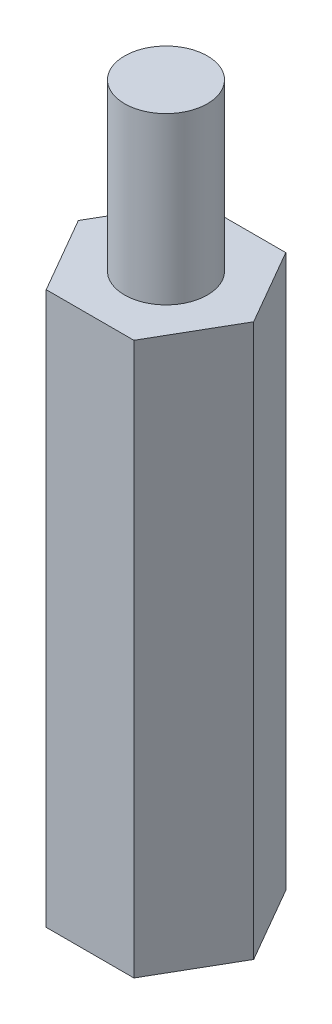
ISO-10303-21;
HEADER;
FILE_DESCRIPTION(('STEP AP214'),'2;1');
FILE_NAME('part.step','',(''),(''),'','','');
FILE_SCHEMA(('AUTOMOTIVE_DESIGN { 1 0 10303 214 1 1 1 1 }'));
ENDSEC;
DATA;
#1=APPLICATION_CONTEXT('core data for automotive mechanical design processes');
#2=APPLICATION_PROTOCOL_DEFINITION('international standard','automotive_design',2000,#1);
#3=PRODUCT_CONTEXT('',#1,'mechanical');
#4=PRODUCT('Part','Part','',(#3));
#5=PRODUCT_RELATED_PRODUCT_CATEGORY('part','',(#4));
#6=PRODUCT_DEFINITION_FORMATION('','',#4);
#7=PRODUCT_DEFINITION_CONTEXT('part definition',#1,'design');
#8=PRODUCT_DEFINITION('design','',#6,#7);
#9=PRODUCT_DEFINITION_SHAPE('','',#8);
#10=(LENGTH_UNIT() NAMED_UNIT(*) SI_UNIT(.MILLI.,.METRE.));
#11=(NAMED_UNIT(*) PLANE_ANGLE_UNIT() SI_UNIT($,.RADIAN.));
#12=(NAMED_UNIT(*) SI_UNIT($,.STERADIAN.) SOLID_ANGLE_UNIT());
#13=UNCERTAINTY_MEASURE_WITH_UNIT(LENGTH_MEASURE(1.E-05),#10,'distance_accuracy_value','');
#14=(GEOMETRIC_REPRESENTATION_CONTEXT(3) GLOBAL_UNCERTAINTY_ASSIGNED_CONTEXT((#13)) GLOBAL_UNIT_ASSIGNED_CONTEXT((#10,
#11,#12)) REPRESENTATION_CONTEXT('',''));
#15=CARTESIAN_POINT('',(0.,0.,0.));
#16=DIRECTION('',(0.,0.,1.));
#17=DIRECTION('',(1.,0.,0.));
#18=AXIS2_PLACEMENT_3D('',#15,#16,#17);
#19=CARTESIAN_POINT('',(0.,20.,0.));
#20=DIRECTION('',(0.,1.,0.));
#21=DIRECTION('',(0.,0.,1.));
#22=AXIS2_PLACEMENT_3D('',#19,#20,#21);
#23=PLANE('',#22);
#24=DIRECTION('',(1.,0.,0.));
#25=VECTOR('',#24,1.);
#26=CARTESIAN_POINT('',(-1.58771324027147,20.,2.75));
#27=LINE('',#26,#25);
#28=CARTESIAN_POINT('',(-1.58771324027147,20.,2.75));
#29=VERTEX_POINT('',#28);
#30=CARTESIAN_POINT('',(1.58771324027147,20.,2.75));
#31=VERTEX_POINT('',#30);
#32=EDGE_CURVE('E136',#29,#31,#27,.T.);
#33=ORIENTED_EDGE('',*,*,#32,.T.);
#34=DIRECTION('',(0.5,0.,-0.866025403784439));
#35=VECTOR('',#34,1.);
#36=CARTESIAN_POINT('',(1.58771324027147,20.,2.75));
#37=LINE('',#36,#35);
#38=CARTESIAN_POINT('',(3.17542648054294,20.,0.));
#39=VERTEX_POINT('',#38);
#40=EDGE_CURVE('E93',#31,#39,#37,.T.);
#41=ORIENTED_EDGE('',*,*,#40,.T.);
#42=DIRECTION('',(-0.5,0.,-0.866025403784439));
#43=VECTOR('',#42,1.);
#44=CARTESIAN_POINT('',(3.17542648054294,20.,0.));
#45=LINE('',#44,#43);
#46=CARTESIAN_POINT('',(1.58771324027147,20.,-2.75));
#47=VERTEX_POINT('',#46);
#48=EDGE_CURVE('E107',#39,#47,#45,.T.);
#49=ORIENTED_EDGE('',*,*,#48,.T.);
#50=DIRECTION('',(-1.,0.,0.));
#51=VECTOR('',#50,1.);
#52=CARTESIAN_POINT('',(1.58771324027147,20.,-2.75));
#53=LINE('',#52,#51);
#54=CARTESIAN_POINT('',(-1.58771324027147,20.,-2.75));
#55=VERTEX_POINT('',#54);
#56=EDGE_CURVE('E101',#47,#55,#53,.T.);
#57=ORIENTED_EDGE('',*,*,#56,.T.);
#58=DIRECTION('',(-0.5,0.,0.866025403784439));
#59=VECTOR('',#58,1.);
#60=CARTESIAN_POINT('',(-1.58771324027147,20.,-2.75));
#61=LINE('',#60,#59);
#62=CARTESIAN_POINT('',(-3.17542648054294,20.,0.));
#63=VERTEX_POINT('',#62);
#64=EDGE_CURVE('E105',#55,#63,#61,.T.);
#65=ORIENTED_EDGE('',*,*,#64,.T.);
#66=DIRECTION('',(0.5,0.,0.866025403784439));
#67=VECTOR('',#66,1.);
#68=CARTESIAN_POINT('',(-3.17542648054294,20.,0.));
#69=LINE('',#68,#67);
#70=EDGE_CURVE('E55',#63,#29,#69,.T.);
#71=ORIENTED_EDGE('',*,*,#70,.T.);
#72=EDGE_LOOP('',(#33,#41,#49,#57,#65,#71));
#73=FACE_BOUND('',#72,.T.);
#74=CARTESIAN_POINT('',(0.,20.,0.));
#75=DIRECTION('',(0.,1.,0.));
#76=DIRECTION('',(0.,0.,1.));
#77=AXIS2_PLACEMENT_3D('',#74,#75,#76);
#78=CIRCLE('',#77,1.5);
#79=CARTESIAN_POINT('',(0.,20.,1.5));
#80=VERTEX_POINT('',#79);
#81=EDGE_CURVE('E191',#80,#80,#78,.T.);
#82=ORIENTED_EDGE('',*,*,#81,.F.);
#83=EDGE_LOOP('',(#82));
#84=FACE_BOUND('',#83,.T.);
#85=ADVANCED_FACE('F38',(#73,#84),#23,.T.);
#86=CARTESIAN_POINT('',(-1.58771324027147,20.,2.75));
#87=DIRECTION('',(0.,0.,-1.));
#88=DIRECTION('',(-1.,0.,0.));
#89=AXIS2_PLACEMENT_3D('',#86,#87,#88);
#90=PLANE('',#89);
#91=DIRECTION('',(1.,0.,0.));
#92=VECTOR('',#91,1.);
#93=CARTESIAN_POINT('',(-1.58771324027147,0.,2.75));
#94=LINE('',#93,#92);
#95=CARTESIAN_POINT('',(-1.58771324027147,0.,2.75));
#96=VERTEX_POINT('',#95);
#97=CARTESIAN_POINT('',(1.58771324027147,0.,2.75));
#98=VERTEX_POINT('',#97);
#99=EDGE_CURVE('E125',#96,#98,#94,.T.);
#100=ORIENTED_EDGE('',*,*,#99,.T.);
#101=DIRECTION('',(0.,-1.,0.));
#102=VECTOR('',#101,1.);
#103=CARTESIAN_POINT('',(1.58771324027147,20.,2.75));
#104=LINE('',#103,#102);
#105=EDGE_CURVE('E11',#31,#98,#104,.T.);
#106=ORIENTED_EDGE('',*,*,#105,.F.);
#107=ORIENTED_EDGE('',*,*,#32,.F.);
#108=DIRECTION('',(0.,-1.,0.));
#109=VECTOR('',#108,1.);
#110=CARTESIAN_POINT('',(-1.58771324027147,20.,2.75));
#111=LINE('',#110,#109);
#112=EDGE_CURVE('E121',#29,#96,#111,.T.);
#113=ORIENTED_EDGE('',*,*,#112,.T.);
#114=EDGE_LOOP('',(#100,#106,#107,#113));
#115=FACE_BOUND('',#114,.T.);
#116=ADVANCED_FACE('F40',(#115),#90,.F.);
#117=CARTESIAN_POINT('',(1.58771324027147,20.,2.75));
#118=DIRECTION('',(-0.866025403784439,0.,-0.5));
#119=DIRECTION('',(-0.5,0.,0.866025403784439));
#120=AXIS2_PLACEMENT_3D('',#117,#118,#119);
#121=PLANE('',#120);
#122=DIRECTION('',(0.5,0.,-0.866025403784439));
#123=VECTOR('',#122,1.);
#124=CARTESIAN_POINT('',(1.58771324027147,0.,2.75));
#125=LINE('',#124,#123);
#126=CARTESIAN_POINT('',(3.17542648054294,0.,0.));
#127=VERTEX_POINT('',#126);
#128=EDGE_CURVE('E128',#98,#127,#125,.T.);
#129=ORIENTED_EDGE('',*,*,#128,.T.);
#130=DIRECTION('',(0.,-1.,0.));
#131=VECTOR('',#130,1.);
#132=CARTESIAN_POINT('',(3.17542648054294,20.,0.));
#133=LINE('',#132,#131);
#134=EDGE_CURVE('E47',#39,#127,#133,.T.);
#135=ORIENTED_EDGE('',*,*,#134,.F.);
#136=ORIENTED_EDGE('',*,*,#40,.F.);
#137=ORIENTED_EDGE('',*,*,#105,.T.);
#138=EDGE_LOOP('',(#129,#135,#136,#137));
#139=FACE_BOUND('',#138,.T.);
#140=ADVANCED_FACE('F165',(#139),#121,.F.);
#141=CARTESIAN_POINT('',(3.17542648054294,20.,0.));
#142=DIRECTION('',(-0.866025403784439,0.,0.5));
#143=DIRECTION('',(0.5,0.,0.866025403784439));
#144=AXIS2_PLACEMENT_3D('',#141,#142,#143);
#145=PLANE('',#144);
#146=DIRECTION('',(-0.5,0.,-0.866025403784439));
#147=VECTOR('',#146,1.);
#148=CARTESIAN_POINT('',(3.17542648054294,0.,0.));
#149=LINE('',#148,#147);
#150=CARTESIAN_POINT('',(1.58771324027147,0.,-2.75));
#151=VERTEX_POINT('',#150);
#152=EDGE_CURVE('E131',#127,#151,#149,.T.);
#153=ORIENTED_EDGE('',*,*,#152,.T.);
#154=DIRECTION('',(0.,-1.,0.));
#155=VECTOR('',#154,1.);
#156=CARTESIAN_POINT('',(1.58771324027147,20.,-2.75));
#157=LINE('',#156,#155);
#158=EDGE_CURVE('E116',#47,#151,#157,.T.);
#159=ORIENTED_EDGE('',*,*,#158,.F.);
#160=ORIENTED_EDGE('',*,*,#48,.F.);
#161=ORIENTED_EDGE('',*,*,#134,.T.);
#162=EDGE_LOOP('',(#153,#159,#160,#161));
#163=FACE_BOUND('',#162,.T.);
#164=ADVANCED_FACE('F142',(#163),#145,.F.);
#165=CARTESIAN_POINT('',(1.58771324027147,20.,-2.75));
#166=DIRECTION('',(0.,0.,1.));
#167=DIRECTION('',(1.,0.,0.));
#168=AXIS2_PLACEMENT_3D('',#165,#166,#167);
#169=PLANE('',#168);
#170=DIRECTION('',(-1.,0.,0.));
#171=VECTOR('',#170,1.);
#172=CARTESIAN_POINT('',(1.58771324027147,0.,-2.75));
#173=LINE('',#172,#171);
#174=CARTESIAN_POINT('',(-1.58771324027147,0.,-2.75));
#175=VERTEX_POINT('',#174);
#176=EDGE_CURVE('E115',#151,#175,#173,.T.);
#177=ORIENTED_EDGE('',*,*,#176,.T.);
#178=DIRECTION('',(0.,-1.,0.));
#179=VECTOR('',#178,1.);
#180=CARTESIAN_POINT('',(-1.58771324027147,20.,-2.75));
#181=LINE('',#180,#179);
#182=EDGE_CURVE('E112',#55,#175,#181,.T.);
#183=ORIENTED_EDGE('',*,*,#182,.F.);
#184=ORIENTED_EDGE('',*,*,#56,.F.);
#185=ORIENTED_EDGE('',*,*,#158,.T.);
#186=EDGE_LOOP('',(#177,#183,#184,#185));
#187=FACE_BOUND('',#186,.T.);
#188=ADVANCED_FACE('F113',(#187),#169,.F.);
#189=CARTESIAN_POINT('',(-1.58771324027147,20.,-2.75));
#190=DIRECTION('',(0.866025403784439,0.,0.5));
#191=DIRECTION('',(0.5,0.,-0.866025403784439));
#192=AXIS2_PLACEMENT_3D('',#189,#190,#191);
#193=PLANE('',#192);
#194=DIRECTION('',(-0.5,0.,0.866025403784439));
#195=VECTOR('',#194,1.);
#196=CARTESIAN_POINT('',(-1.58771324027147,0.,-2.75));
#197=LINE('',#196,#195);
#198=CARTESIAN_POINT('',(-3.17542648054294,0.,0.));
#199=VERTEX_POINT('',#198);
#200=EDGE_CURVE('E79',#175,#199,#197,.T.);
#201=ORIENTED_EDGE('',*,*,#200,.T.);
#202=DIRECTION('',(0.,-1.,0.));
#203=VECTOR('',#202,1.);
#204=CARTESIAN_POINT('',(-3.17542648054294,20.,0.));
#205=LINE('',#204,#203);
#206=EDGE_CURVE('E117',#63,#199,#205,.T.);
#207=ORIENTED_EDGE('',*,*,#206,.F.);
#208=ORIENTED_EDGE('',*,*,#64,.F.);
#209=ORIENTED_EDGE('',*,*,#182,.T.);
#210=EDGE_LOOP('',(#201,#207,#208,#209));
#211=FACE_BOUND('',#210,.T.);
#212=ADVANCED_FACE('F119',(#211),#193,.F.);
#213=CARTESIAN_POINT('',(-3.17542648054294,20.,0.));
#214=DIRECTION('',(0.866025403784439,0.,-0.5));
#215=DIRECTION('',(-0.5,0.,-0.866025403784439));
#216=AXIS2_PLACEMENT_3D('',#213,#214,#215);
#217=PLANE('',#216);
#218=DIRECTION('',(0.5,0.,0.866025403784439));
#219=VECTOR('',#218,1.);
#220=CARTESIAN_POINT('',(-3.17542648054294,0.,0.));
#221=LINE('',#220,#219);
#222=EDGE_CURVE('E85',#199,#96,#221,.T.);
#223=ORIENTED_EDGE('',*,*,#222,.T.);
#224=ORIENTED_EDGE('',*,*,#112,.F.);
#225=ORIENTED_EDGE('',*,*,#70,.F.);
#226=ORIENTED_EDGE('',*,*,#206,.T.);
#227=EDGE_LOOP('',(#223,#224,#225,#226));
#228=FACE_BOUND('',#227,.T.);
#229=ADVANCED_FACE('F149',(#228),#217,.F.);
#230=CARTESIAN_POINT('',(0.,0.,0.));
#231=DIRECTION('',(0.,1.,0.));
#232=DIRECTION('',(0.,0.,1.));
#233=AXIS2_PLACEMENT_3D('',#230,#231,#232);
#234=PLANE('',#233);
#235=CARTESIAN_POINT('',(0.,0.,0.));
#236=DIRECTION('',(0.,-1.,0.));
#237=DIRECTION('',(0.,0.,-1.));
#238=AXIS2_PLACEMENT_3D('',#235,#236,#237);
#239=CIRCLE('',#238,1.25);
#240=CARTESIAN_POINT('',(0.,0.,-1.25));
#241=VERTEX_POINT('',#240);
#242=EDGE_CURVE('E189',#241,#241,#239,.T.);
#243=ORIENTED_EDGE('',*,*,#242,.F.);
#244=EDGE_LOOP('',(#243));
#245=FACE_BOUND('',#244,.T.);
#246=ORIENTED_EDGE('',*,*,#99,.F.);
#247=ORIENTED_EDGE('',*,*,#222,.F.);
#248=ORIENTED_EDGE('',*,*,#200,.F.);
#249=ORIENTED_EDGE('',*,*,#176,.F.);
#250=ORIENTED_EDGE('',*,*,#152,.F.);
#251=ORIENTED_EDGE('',*,*,#128,.F.);
#252=EDGE_LOOP('',(#246,#247,#248,#249,#250,#251));
#253=FACE_BOUND('',#252,.T.);
#254=ADVANCED_FACE('F145',(#245,#253),#234,.F.);
#255=CARTESIAN_POINT('',(0.,26.,0.));
#256=DIRECTION('',(0.,-1.,0.));
#257=DIRECTION('',(0.,0.,-1.));
#258=AXIS2_PLACEMENT_3D('',#255,#256,#257);
#259=CYLINDRICAL_SURFACE('',#258,1.5);
#260=CARTESIAN_POINT('',(0.,26.,0.));
#261=DIRECTION('',(0.,1.,0.));
#262=DIRECTION('',(0.,0.,1.));
#263=AXIS2_PLACEMENT_3D('',#260,#261,#262);
#264=CIRCLE('',#263,1.5);
#265=CARTESIAN_POINT('',(0.,26.,1.5));
#266=VERTEX_POINT('',#265);
#267=EDGE_CURVE('E129',#266,#266,#264,.T.);
#268=ORIENTED_EDGE('',*,*,#267,.F.);
#269=EDGE_LOOP('',(#268));
#270=FACE_BOUND('',#269,.T.);
#271=ORIENTED_EDGE('',*,*,#81,.T.);
#272=EDGE_LOOP('',(#271));
#273=FACE_BOUND('',#272,.T.);
#274=ADVANCED_FACE('F156',(#270,#273),#259,.T.);
#275=CARTESIAN_POINT('',(0.,26.,0.));
#276=DIRECTION('',(0.,1.,0.));
#277=DIRECTION('',(0.,0.,1.));
#278=AXIS2_PLACEMENT_3D('',#275,#276,#277);
#279=PLANE('',#278);
#280=ORIENTED_EDGE('',*,*,#267,.T.);
#281=EDGE_LOOP('',(#280));
#282=FACE_BOUND('',#281,.T.);
#283=ADVANCED_FACE('F169',(#282),#279,.T.);
#284=CARTESIAN_POINT('',(0.,8.5,0.));
#285=DIRECTION('',(0.,-1.,0.));
#286=DIRECTION('',(0.,0.,-1.));
#287=AXIS2_PLACEMENT_3D('',#284,#285,#286);
#288=CONICAL_SURFACE('',#287,1.25,1.02974425867665);
#289=CARTESIAN_POINT('',(0.,9.25107577378445,0.));
#290=VERTEX_POINT('',#289);
#291=VERTEX_LOOP('',#290);
#292=FACE_BOUND('',#291,.T.);
#293=CARTESIAN_POINT('',(0.,8.5,0.));
#294=DIRECTION('',(0.,-1.,0.));
#295=DIRECTION('',(0.,0.,-1.));
#296=AXIS2_PLACEMENT_3D('',#293,#294,#295);
#297=CIRCLE('',#296,1.25);
#298=CARTESIAN_POINT('',(0.,8.5,-1.25));
#299=VERTEX_POINT('',#298);
#300=EDGE_CURVE('E186',#299,#299,#297,.T.);
#301=ORIENTED_EDGE('',*,*,#300,.T.);
#302=EDGE_LOOP('',(#301));
#303=FACE_BOUND('',#302,.T.);
#304=ADVANCED_FACE('F173',(#292,#303),#288,.F.);
#305=CARTESIAN_POINT('',(0.,0.,0.));
#306=DIRECTION('',(0.,-1.,0.));
#307=DIRECTION('',(0.,0.,-1.));
#308=AXIS2_PLACEMENT_3D('',#305,#306,#307);
#309=CYLINDRICAL_SURFACE('',#308,1.25);
#310=ORIENTED_EDGE('',*,*,#300,.F.);
#311=EDGE_LOOP('',(#310));
#312=FACE_BOUND('',#311,.T.);
#313=ORIENTED_EDGE('',*,*,#242,.T.);
#314=EDGE_LOOP('',(#313));
#315=FACE_BOUND('',#314,.T.);
#316=ADVANCED_FACE('F177',(#312,#315),#309,.F.);
#317=CLOSED_SHELL('',(#85,#116,#140,#164,#188,#212,#229,#254,#274,#283,#304,#316));
#318=MANIFOLD_SOLID_BREP('B2',#317);
#319=ADVANCED_BREP_SHAPE_REPRESENTATION('',(#18,#318),#14);
#320=SHAPE_DEFINITION_REPRESENTATION(#9,#319);
ENDSEC;
END-ISO-10303-21;
